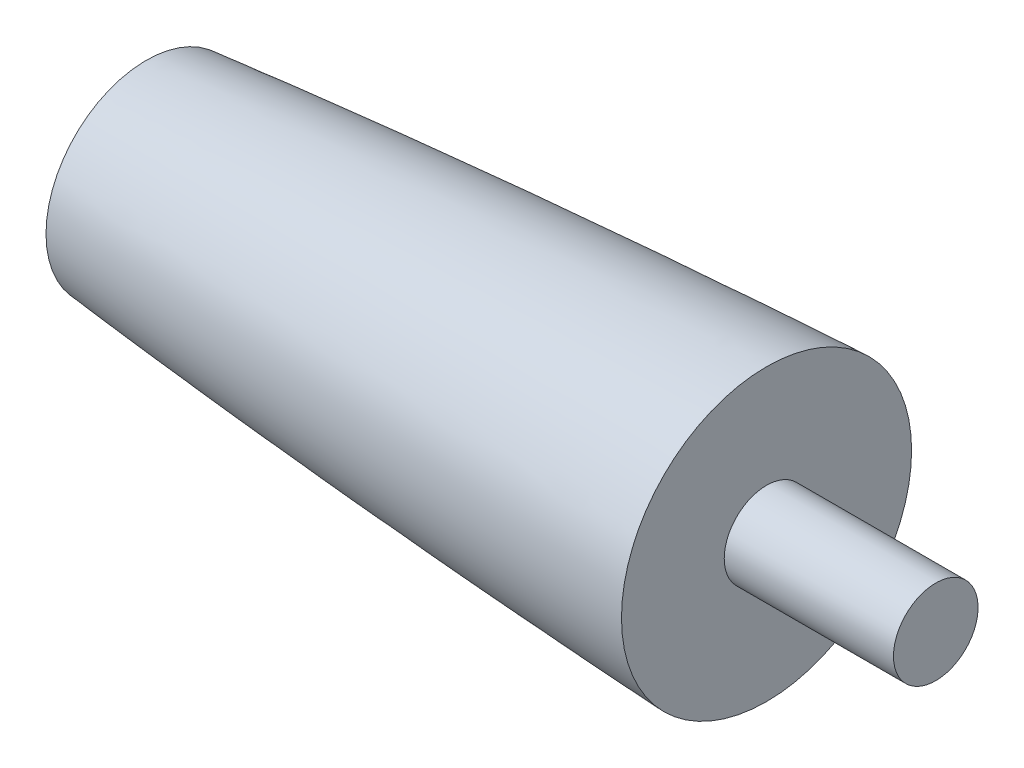
ISO-10303-21;
HEADER;
FILE_DESCRIPTION(('STEP AP214'),'2;1');
FILE_NAME('part.step','',(''),(''),'','','');
FILE_SCHEMA(('AUTOMOTIVE_DESIGN { 1 0 10303 214 1 1 1 1 }'));
ENDSEC;
DATA;
#1=APPLICATION_CONTEXT('core data for automotive mechanical design processes');
#2=APPLICATION_PROTOCOL_DEFINITION('international standard','automotive_design',2000,#1);
#3=PRODUCT_CONTEXT('',#1,'mechanical');
#4=PRODUCT('Part','Part','',(#3));
#5=PRODUCT_RELATED_PRODUCT_CATEGORY('part','',(#4));
#6=PRODUCT_DEFINITION_FORMATION('','',#4);
#7=PRODUCT_DEFINITION_CONTEXT('part definition',#1,'design');
#8=PRODUCT_DEFINITION('design','',#6,#7);
#9=PRODUCT_DEFINITION_SHAPE('','',#8);
#10=(LENGTH_UNIT() NAMED_UNIT(*) SI_UNIT(.MILLI.,.METRE.));
#11=(NAMED_UNIT(*) PLANE_ANGLE_UNIT() SI_UNIT($,.RADIAN.));
#12=(NAMED_UNIT(*) SI_UNIT($,.STERADIAN.) SOLID_ANGLE_UNIT());
#13=UNCERTAINTY_MEASURE_WITH_UNIT(LENGTH_MEASURE(1.E-05),#10,'distance_accuracy_value','');
#14=(GEOMETRIC_REPRESENTATION_CONTEXT(3) GLOBAL_UNCERTAINTY_ASSIGNED_CONTEXT((#13)) GLOBAL_UNIT_ASSIGNED_CONTEXT((#10,
#11,#12)) REPRESENTATION_CONTEXT('',''));
#15=CARTESIAN_POINT('',(0.,0.,0.));
#16=DIRECTION('',(0.,0.,1.));
#17=DIRECTION('',(1.,0.,0.));
#18=AXIS2_PLACEMENT_3D('',#15,#16,#17);
#19=CARTESIAN_POINT('',(423.200000000824,0.,0.));
#20=DIRECTION('',(-1.,0.,0.));
#21=DIRECTION('',(0.,0.,1.));
#22=AXIS2_PLACEMENT_3D('',#19,#20,#21);
#23=PLANE('',#22);
#24=CARTESIAN_POINT('',(423.200000000824,0.,0.));
#25=DIRECTION('',(-1.,0.,0.));
#26=DIRECTION('',(0.,0.,1.));
#27=AXIS2_PLACEMENT_3D('',#24,#25,#26);
#28=CIRCLE('',#27,12.7000000007353);
#29=CARTESIAN_POINT('',(423.200000000824,0.,12.7000000007353));
#30=VERTEX_POINT('',#29);
#31=EDGE_CURVE('E10',#30,#30,#28,.T.);
#32=ORIENTED_EDGE('',*,*,#31,.F.);
#33=EDGE_LOOP('',(#32));
#34=FACE_BOUND('',#33,.T.);
#35=ADVANCED_FACE('F43',(#34),#23,.F.);
#36=CARTESIAN_POINT('',(186.200000000824,0.,0.));
#37=DIRECTION('',(-1.,0.,0.));
#38=DIRECTION('',(0.,0.,1.));
#39=AXIS2_PLACEMENT_3D('',#36,#37,#38);
#40=CYLINDRICAL_SURFACE('',#39,12.7000000007353);
#41=CARTESIAN_POINT('',(372.400000000751,0.,0.));
#42=DIRECTION('',(-1.,0.,0.));
#43=DIRECTION('',(0.,0.,1.));
#44=AXIS2_PLACEMENT_3D('',#41,#42,#43);
#45=CIRCLE('',#44,12.7000000007353);
#46=CARTESIAN_POINT('',(372.400000000751,0.,12.7000000007353));
#47=VERTEX_POINT('',#46);
#48=EDGE_CURVE('E50',#47,#47,#45,.T.);
#49=ORIENTED_EDGE('',*,*,#48,.F.);
#50=EDGE_LOOP('',(#49));
#51=FACE_BOUND('',#50,.T.);
#52=ORIENTED_EDGE('',*,*,#31,.T.);
#53=EDGE_LOOP('',(#52));
#54=FACE_BOUND('',#53,.T.);
#55=ADVANCED_FACE('F86',(#51,#54),#40,.T.);
#56=CARTESIAN_POINT('',(372.39999999881,0.,-12.7000000007353));
#57=DIRECTION('',(-1.,0.,0.));
#58=DIRECTION('',(0.,0.,1.));
#59=AXIS2_PLACEMENT_3D('',#56,#57,#58);
#60=PLANE('',#59);
#61=CARTESIAN_POINT('',(372.399999996868,0.,0.));
#62=DIRECTION('',(-1.,0.,0.));
#63=DIRECTION('',(0.,0.,1.));
#64=AXIS2_PLACEMENT_3D('',#61,#62,#63);
#65=CIRCLE('',#64,43.5412761811273);
#66=CARTESIAN_POINT('',(372.399999996868,0.,43.5412761811273));
#67=VERTEX_POINT('',#66);
#68=EDGE_CURVE('E55',#67,#67,#65,.T.);
#69=ORIENTED_EDGE('',*,*,#68,.F.);
#70=EDGE_LOOP('',(#69));
#71=FACE_BOUND('',#70,.T.);
#72=ORIENTED_EDGE('',*,*,#48,.T.);
#73=EDGE_LOOP('',(#72));
#74=FACE_BOUND('',#73,.T.);
#75=ADVANCED_FACE('F82',(#71,#74),#60,.F.);
#76=CARTESIAN_POINT('',(372.399999996868,0.,-43.5412761811273));
#77=CARTESIAN_POINT('',(371.099783503394,0.,-43.4776542051105));
#78=CARTESIAN_POINT('',(368.611231025358,0.,-43.35442242));
#79=CARTESIAN_POINT('',(362.148695019991,0.,-43.03160343386));
#80=CARTESIAN_POINT('',(357.350114047077,0.,-42.7791407201924));
#81=CARTESIAN_POINT('',(350.249018574576,0.,-42.4050789202505));
#82=CARTESIAN_POINT('',(344.539308290737,0.,-42.0900978588151));
#83=CARTESIAN_POINT('',(337.986917367824,0.,-41.7248039540227));
#84=CARTESIAN_POINT('',(331.946600138045,0.,-41.3754120879125));
#85=CARTESIAN_POINT('',(325.596967327056,0.,-41.0016415861509));
#86=CARTESIAN_POINT('',(319.434498319003,0.,-40.6277070132057));
#87=CARTESIAN_POINT('',(313.162009425385,0.,-40.2389600335609));
#88=CARTESIAN_POINT('',(306.952841489345,0.,-39.8438076533881));
#89=CARTESIAN_POINT('',(299.152723668114,0.,-39.3359266826288));
#90=CARTESIAN_POINT('',(289.816198167119,0.,-38.7082106092969));
#91=CARTESIAN_POINT('',(279.061816884457,0.,-37.9568778544021));
#92=CARTESIAN_POINT('',(268.320529045247,0.,-37.1718325541741));
#93=CARTESIAN_POINT('',(259.130032910698,0.,-36.4749983700104));
#94=CARTESIAN_POINT('',(251.503725386348,0.,-35.8797803119159));
#95=CARTESIAN_POINT('',(245.275292167438,0.,-35.3827442589564));
#96=CARTESIAN_POINT('',(239.059679793099,0.,-34.875915665687));
#97=CARTESIAN_POINT('',(232.825098633605,0.,-34.3560263414303));
#98=CARTESIAN_POINT('',(226.624337905553,0.,-33.8280712454997));
#99=CARTESIAN_POINT('',(220.37033095182,0.,-33.2832421270409));
#100=CARTESIAN_POINT('',(214.207072830104,0.,-32.7355719638314));
#101=CARTESIAN_POINT('',(207.895023629932,0.,-32.1611023573042));
#102=CARTESIAN_POINT('',(201.841921662664,0.,-31.5999794357991));
#103=CARTESIAN_POINT('',(196.125115807645,0.,-31.0563469687053));
#104=CARTESIAN_POINT('',(191.919274255276,0.,-30.6511318417257));
#105=CARTESIAN_POINT('',(188.16821412704,0.,-30.282777799328));
#106=CARTESIAN_POINT('',(186.847714314575,0.,-30.1524920566724));
#107=CARTESIAN_POINT('',(186.199999996954,0.,-30.0883136879083));
#108=B_SPLINE_CURVE_WITH_KNOTS('',4,(#76,#77,#78,#79,#80,#81,#82,#83,#84,#85,#86,#87,#88,#89,
#90,#91,#92,#93,#94,#95,#96,#97,#98,#99,#100,#101,#102,#103,#104,#105,#106,#107),.UNSPECIFIED.,
.F.,.F.,(5,1,1,1,1,1,1,1,1,1,1,1,1,1,1,1,1,1,1,1,1,1,1,1,1,1,1,1,5),(0.0827700272968049,
0.110659516940734,0.138549006563832,0.166438496213647,0.194327985863462,0.222217475540948,
0.250106965218434,0.277996454930099,0.305885944641764,0.333775434387908,0.361664924134051,
0.389554413841795,0.417443903549539,0.473222882824683,0.529001862110457,0.582063403775955,
0.609952893128399,0.637842383018026,0.665731872607384,0.693621362792586,0.721510852312267,
0.749400342181348,0.777289831246084,0.805179321007993,0.833068810322998,0.860958300644012,
0.88884779010113,0.902792535387245,0.916737280651415),.UNSPECIFIED.);
#109=CARTESIAN_POINT('',(186.200000000824,0.,0.));
#110=DIRECTION('',(-1.,0.,0.));
#111=AXIS1_PLACEMENT('',#109,#110);
#112=SURFACE_OF_REVOLUTION('',#108,#111);
#113=CARTESIAN_POINT('',(186.200000000824,0.,0.));
#114=DIRECTION('',(-1.,0.,0.));
#115=DIRECTION('',(0.,0.,1.));
#116=AXIS2_PLACEMENT_3D('',#113,#114,#115);
#117=CIRCLE('',#116,30.0883136882918);
#118=CARTESIAN_POINT('',(186.200000000824,0.,30.0883136882918));
#119=VERTEX_POINT('',#118);
#120=EDGE_CURVE('E60',#119,#119,#117,.T.);
#121=ORIENTED_EDGE('',*,*,#120,.F.);
#122=EDGE_LOOP('',(#121));
#123=FACE_BOUND('',#122,.T.);
#124=ORIENTED_EDGE('',*,*,#68,.T.);
#125=EDGE_LOOP('',(#124));
#126=FACE_BOUND('',#125,.T.);
#127=ADVANCED_FACE('F77',(#123,#126),#112,.T.);
#128=CARTESIAN_POINT('',(186.200000000824,0.,-30.0883136882918));
#129=DIRECTION('',(1.,0.,0.));
#130=DIRECTION('',(0.,0.,-1.));
#131=AXIS2_PLACEMENT_3D('',#128,#129,#130);
#132=PLANE('',#131);
#133=CARTESIAN_POINT('',(186.200000000824,0.,0.));
#134=DIRECTION('',(-1.,0.,0.));
#135=DIRECTION('',(0.,0.,1.));
#136=AXIS2_PLACEMENT_3D('',#133,#134,#135);
#137=CIRCLE('',#136,12.7);
#138=CARTESIAN_POINT('',(186.200000000824,0.,12.7));
#139=VERTEX_POINT('',#138);
#140=EDGE_CURVE('E71',#139,#139,#137,.T.);
#141=ORIENTED_EDGE('',*,*,#140,.F.);
#142=EDGE_LOOP('',(#141));
#143=FACE_BOUND('',#142,.T.);
#144=ORIENTED_EDGE('',*,*,#120,.T.);
#145=EDGE_LOOP('',(#144));
#146=FACE_BOUND('',#145,.T.);
#147=ADVANCED_FACE('F81',(#143,#146),#132,.F.);
#148=CARTESIAN_POINT('',(237.000000000824,0.,0.));
#149=DIRECTION('',(-1.,0.,0.));
#150=DIRECTION('',(0.,0.,1.));
#151=AXIS2_PLACEMENT_3D('',#148,#149,#150);
#152=CYLINDRICAL_SURFACE('',#151,12.7);
#153=CARTESIAN_POINT('',(237.000000000824,0.,0.));
#154=DIRECTION('',(-1.,0.,0.));
#155=DIRECTION('',(0.,0.,1.));
#156=AXIS2_PLACEMENT_3D('',#153,#154,#155);
#157=CIRCLE('',#156,12.7);
#158=CARTESIAN_POINT('',(237.000000000824,0.,12.7));
#159=VERTEX_POINT('',#158);
#160=EDGE_CURVE('E66',#159,#159,#157,.T.);
#161=ORIENTED_EDGE('',*,*,#160,.F.);
#162=EDGE_LOOP('',(#161));
#163=FACE_BOUND('',#162,.T.);
#164=ORIENTED_EDGE('',*,*,#140,.T.);
#165=EDGE_LOOP('',(#164));
#166=FACE_BOUND('',#165,.T.);
#167=ADVANCED_FACE('F122',(#163,#166),#152,.F.);
#168=CARTESIAN_POINT('',(237.000000000824,0.,0.));
#169=DIRECTION('',(-1.,0.,0.));
#170=DIRECTION('',(0.,0.,1.));
#171=AXIS2_PLACEMENT_3D('',#168,#169,#170);
#172=PLANE('',#171);
#173=ORIENTED_EDGE('',*,*,#160,.T.);
#174=EDGE_LOOP('',(#173));
#175=FACE_BOUND('',#174,.T.);
#176=ADVANCED_FACE('F131',(#175),#172,.T.);
#177=CLOSED_SHELL('',(#35,#55,#75,#127,#147,#167,#176));
#178=MANIFOLD_SOLID_BREP('B2',#177);
#179=ADVANCED_BREP_SHAPE_REPRESENTATION('',(#18,#178),#14);
#180=SHAPE_DEFINITION_REPRESENTATION(#9,#179);
ENDSEC;
END-ISO-10303-21;
